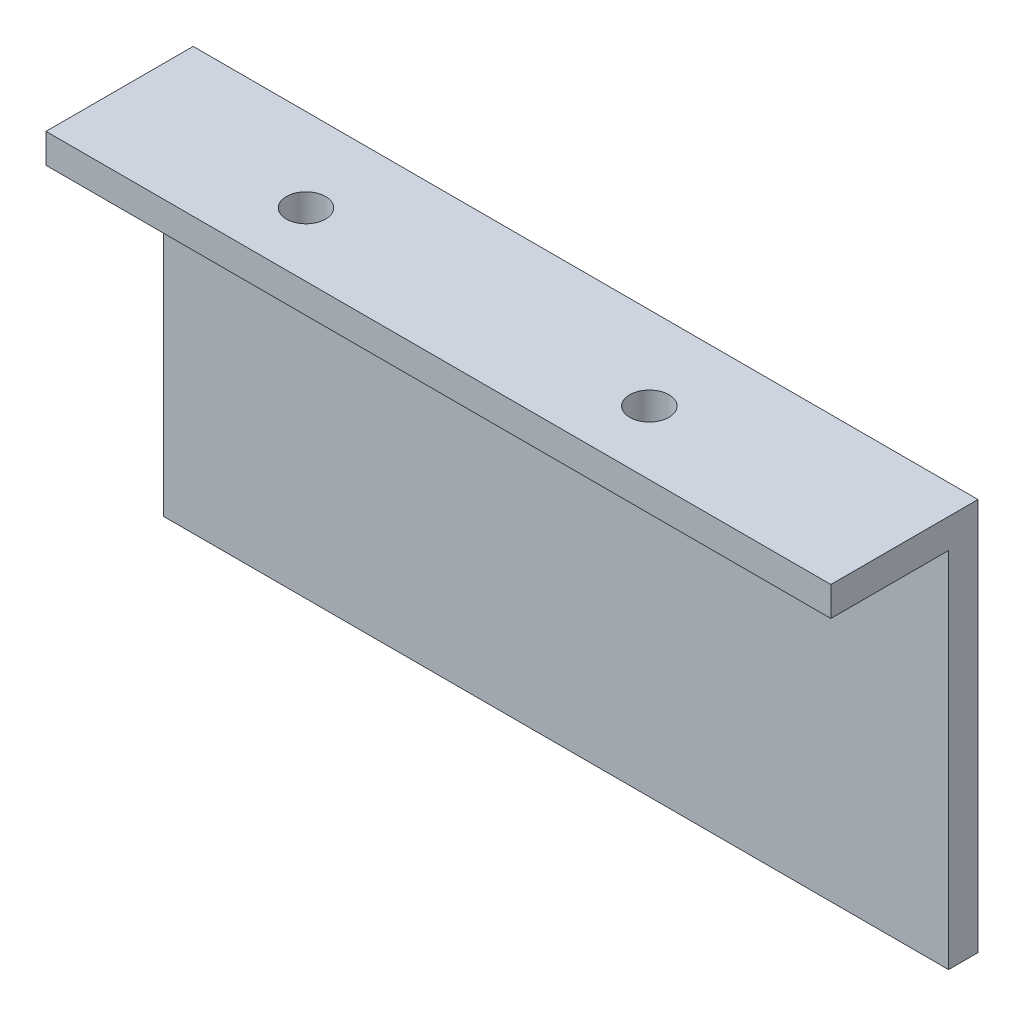
ISO-10303-21;
HEADER;
FILE_DESCRIPTION(('STEP AP214'),'2;1');
FILE_NAME('part.step','',(''),(''),'','','');
FILE_SCHEMA(('AUTOMOTIVE_DESIGN { 1 0 10303 214 1 1 1 1 }'));
ENDSEC;
DATA;
#1=APPLICATION_CONTEXT('core data for automotive mechanical design processes');
#2=APPLICATION_PROTOCOL_DEFINITION('international standard','automotive_design',2000,#1);
#3=PRODUCT_CONTEXT('',#1,'mechanical');
#4=PRODUCT('Part','Part','',(#3));
#5=PRODUCT_RELATED_PRODUCT_CATEGORY('part','',(#4));
#6=PRODUCT_DEFINITION_FORMATION('','',#4);
#7=PRODUCT_DEFINITION_CONTEXT('part definition',#1,'design');
#8=PRODUCT_DEFINITION('design','',#6,#7);
#9=PRODUCT_DEFINITION_SHAPE('','',#8);
#10=(LENGTH_UNIT() NAMED_UNIT(*) SI_UNIT(.MILLI.,.METRE.));
#11=(NAMED_UNIT(*) PLANE_ANGLE_UNIT() SI_UNIT($,.RADIAN.));
#12=(NAMED_UNIT(*) SI_UNIT($,.STERADIAN.) SOLID_ANGLE_UNIT());
#13=UNCERTAINTY_MEASURE_WITH_UNIT(LENGTH_MEASURE(1.E-05),#10,'distance_accuracy_value','');
#14=(GEOMETRIC_REPRESENTATION_CONTEXT(3) GLOBAL_UNCERTAINTY_ASSIGNED_CONTEXT((#13)) GLOBAL_UNIT_ASSIGNED_CONTEXT((#10,
#11,#12)) REPRESENTATION_CONTEXT('',''));
#15=CARTESIAN_POINT('',(0.,0.,0.));
#16=DIRECTION('',(0.,0.,1.));
#17=DIRECTION('',(1.,0.,0.));
#18=AXIS2_PLACEMENT_3D('',#15,#16,#17);
#19=CARTESIAN_POINT('',(40.,20.,3.));
#20=DIRECTION('',(-1.,0.,0.));
#21=DIRECTION('',(0.,-1.,0.));
#22=AXIS2_PLACEMENT_3D('',#19,#20,#21);
#23=PLANE('',#22);
#24=DIRECTION('',(0.,1.,0.));
#25=VECTOR('',#24,1.);
#26=CARTESIAN_POINT('',(40.,20.,0.));
#27=LINE('',#26,#25);
#28=CARTESIAN_POINT('',(40.,-20.,0.));
#29=VERTEX_POINT('',#28);
#30=CARTESIAN_POINT('',(40.,20.,0.));
#31=VERTEX_POINT('',#30);
#32=EDGE_CURVE('E98',#29,#31,#27,.T.);
#33=ORIENTED_EDGE('',*,*,#32,.T.);
#34=DIRECTION('',(0.,0.,-1.));
#35=VECTOR('',#34,1.);
#36=CARTESIAN_POINT('',(40.,20.,3.));
#37=LINE('',#36,#35);
#38=CARTESIAN_POINT('',(40.,20.,15.));
#39=VERTEX_POINT('',#38);
#40=EDGE_CURVE('E11',#39,#31,#37,.T.);
#41=ORIENTED_EDGE('',*,*,#40,.F.);
#42=DIRECTION('',(0.,1.,0.));
#43=VECTOR('',#42,1.);
#44=CARTESIAN_POINT('',(40.,20.,15.));
#45=LINE('',#44,#43);
#46=CARTESIAN_POINT('',(40.,17.,15.));
#47=VERTEX_POINT('',#46);
#48=EDGE_CURVE('E148',#47,#39,#45,.T.);
#49=ORIENTED_EDGE('',*,*,#48,.F.);
#50=DIRECTION('',(0.,0.,-1.));
#51=VECTOR('',#50,1.);
#52=CARTESIAN_POINT('',(40.,17.,15.));
#53=LINE('',#52,#51);
#54=CARTESIAN_POINT('',(40.,17.,3.));
#55=VERTEX_POINT('',#54);
#56=EDGE_CURVE('E111',#47,#55,#53,.T.);
#57=ORIENTED_EDGE('',*,*,#56,.T.);
#58=DIRECTION('',(0.,1.,0.));
#59=VECTOR('',#58,1.);
#60=CARTESIAN_POINT('',(40.,20.,3.));
#61=LINE('',#60,#59);
#62=CARTESIAN_POINT('',(40.,-20.,3.));
#63=VERTEX_POINT('',#62);
#64=EDGE_CURVE('E92',#63,#55,#61,.T.);
#65=ORIENTED_EDGE('',*,*,#64,.F.);
#66=DIRECTION('',(0.,0.,-1.));
#67=VECTOR('',#66,1.);
#68=CARTESIAN_POINT('',(40.,-20.,3.));
#69=LINE('',#68,#67);
#70=EDGE_CURVE('E84',#63,#29,#69,.T.);
#71=ORIENTED_EDGE('',*,*,#70,.T.);
#72=EDGE_LOOP('',(#33,#41,#49,#57,#65,#71));
#73=FACE_BOUND('',#72,.T.);
#74=ADVANCED_FACE('F39',(#73),#23,.F.);
#75=CARTESIAN_POINT('',(-40.,20.,3.));
#76=DIRECTION('',(0.,-1.,0.));
#77=DIRECTION('',(0.,0.,-1.));
#78=AXIS2_PLACEMENT_3D('',#75,#76,#77);
#79=PLANE('',#78);
#80=CARTESIAN_POINT('',(15.,20.,8.5));
#81=DIRECTION('',(0.,1.,0.));
#82=DIRECTION('',(0.,0.,1.));
#83=AXIS2_PLACEMENT_3D('',#80,#81,#82);
#84=CIRCLE('',#83,2.);
#85=CARTESIAN_POINT('',(15.,20.,10.5));
#86=VERTEX_POINT('',#85);
#87=EDGE_CURVE('E125',#86,#86,#84,.T.);
#88=ORIENTED_EDGE('',*,*,#87,.F.);
#89=EDGE_LOOP('',(#88));
#90=FACE_BOUND('',#89,.T.);
#91=CARTESIAN_POINT('',(-20.,20.,8.5));
#92=DIRECTION('',(0.,1.,0.));
#93=DIRECTION('',(0.,0.,1.));
#94=AXIS2_PLACEMENT_3D('',#91,#92,#93);
#95=CIRCLE('',#94,2.);
#96=CARTESIAN_POINT('',(-20.,20.,10.5));
#97=VERTEX_POINT('',#96);
#98=EDGE_CURVE('E132',#97,#97,#95,.T.);
#99=ORIENTED_EDGE('',*,*,#98,.F.);
#100=EDGE_LOOP('',(#99));
#101=FACE_BOUND('',#100,.T.);
#102=DIRECTION('',(-1.,0.,0.));
#103=VECTOR('',#102,1.);
#104=CARTESIAN_POINT('',(-40.,20.,0.));
#105=LINE('',#104,#103);
#106=CARTESIAN_POINT('',(-40.,20.,0.));
#107=VERTEX_POINT('',#106);
#108=EDGE_CURVE('E103',#31,#107,#105,.T.);
#109=ORIENTED_EDGE('',*,*,#108,.T.);
#110=DIRECTION('',(0.,0.,-1.));
#111=VECTOR('',#110,1.);
#112=CARTESIAN_POINT('',(-40.,20.,3.));
#113=LINE('',#112,#111);
#114=CARTESIAN_POINT('',(-40.,20.,15.));
#115=VERTEX_POINT('',#114);
#116=EDGE_CURVE('E48',#115,#107,#113,.T.);
#117=ORIENTED_EDGE('',*,*,#116,.F.);
#118=DIRECTION('',(-1.,0.,0.));
#119=VECTOR('',#118,1.);
#120=CARTESIAN_POINT('',(-40.,20.,15.));
#121=LINE('',#120,#119);
#122=EDGE_CURVE('E152',#39,#115,#121,.T.);
#123=ORIENTED_EDGE('',*,*,#122,.F.);
#124=ORIENTED_EDGE('',*,*,#40,.T.);
#125=EDGE_LOOP('',(#109,#117,#123,#124));
#126=FACE_BOUND('',#125,.T.);
#127=ADVANCED_FACE('F172',(#90,#101,#126),#79,.F.);
#128=CARTESIAN_POINT('',(-40.,20.,3.));
#129=DIRECTION('',(1.,0.,0.));
#130=DIRECTION('',(0.,0.,-1.));
#131=AXIS2_PLACEMENT_3D('',#128,#129,#130);
#132=PLANE('',#131);
#133=DIRECTION('',(0.,-1.,0.));
#134=VECTOR('',#133,1.);
#135=CARTESIAN_POINT('',(-40.,20.,0.));
#136=LINE('',#135,#134);
#137=CARTESIAN_POINT('',(-40.,-20.,0.));
#138=VERTEX_POINT('',#137);
#139=EDGE_CURVE('E93',#107,#138,#136,.T.);
#140=ORIENTED_EDGE('',*,*,#139,.T.);
#141=DIRECTION('',(0.,0.,-1.));
#142=VECTOR('',#141,1.);
#143=CARTESIAN_POINT('',(-40.,-20.,3.));
#144=LINE('',#143,#142);
#145=CARTESIAN_POINT('',(-40.,-20.,3.));
#146=VERTEX_POINT('',#145);
#147=EDGE_CURVE('E87',#146,#138,#144,.T.);
#148=ORIENTED_EDGE('',*,*,#147,.F.);
#149=DIRECTION('',(0.,-1.,0.));
#150=VECTOR('',#149,1.);
#151=CARTESIAN_POINT('',(-40.,20.,3.));
#152=LINE('',#151,#150);
#153=CARTESIAN_POINT('',(-40.,17.,3.));
#154=VERTEX_POINT('',#153);
#155=EDGE_CURVE('E161',#154,#146,#152,.T.);
#156=ORIENTED_EDGE('',*,*,#155,.F.);
#157=DIRECTION('',(0.,0.,-1.));
#158=VECTOR('',#157,1.);
#159=CARTESIAN_POINT('',(-40.,17.,15.));
#160=LINE('',#159,#158);
#161=CARTESIAN_POINT('',(-40.,17.,15.));
#162=VERTEX_POINT('',#161);
#163=EDGE_CURVE('E105',#162,#154,#160,.T.);
#164=ORIENTED_EDGE('',*,*,#163,.F.);
#165=DIRECTION('',(0.,-1.,0.));
#166=VECTOR('',#165,1.);
#167=CARTESIAN_POINT('',(-40.,20.,15.));
#168=LINE('',#167,#166);
#169=EDGE_CURVE('E140',#115,#162,#168,.T.);
#170=ORIENTED_EDGE('',*,*,#169,.F.);
#171=ORIENTED_EDGE('',*,*,#116,.T.);
#172=EDGE_LOOP('',(#140,#148,#156,#164,#170,#171));
#173=FACE_BOUND('',#172,.T.);
#174=ADVANCED_FACE('F167',(#173),#132,.F.);
#175=CARTESIAN_POINT('',(-40.,-20.,3.));
#176=DIRECTION('',(0.,1.,0.));
#177=DIRECTION('',(0.,0.,1.));
#178=AXIS2_PLACEMENT_3D('',#175,#176,#177);
#179=PLANE('',#178);
#180=DIRECTION('',(1.,0.,0.));
#181=VECTOR('',#180,1.);
#182=CARTESIAN_POINT('',(-40.,-20.,0.));
#183=LINE('',#182,#181);
#184=EDGE_CURVE('E81',#138,#29,#183,.T.);
#185=ORIENTED_EDGE('',*,*,#184,.T.);
#186=ORIENTED_EDGE('',*,*,#70,.F.);
#187=DIRECTION('',(1.,0.,0.));
#188=VECTOR('',#187,1.);
#189=CARTESIAN_POINT('',(-40.,-20.,3.));
#190=LINE('',#189,#188);
#191=EDGE_CURVE('E62',#146,#63,#190,.T.);
#192=ORIENTED_EDGE('',*,*,#191,.F.);
#193=ORIENTED_EDGE('',*,*,#147,.T.);
#194=EDGE_LOOP('',(#185,#186,#192,#193));
#195=FACE_BOUND('',#194,.T.);
#196=ADVANCED_FACE('F83',(#195),#179,.F.);
#197=CARTESIAN_POINT('',(0.,0.,3.));
#198=DIRECTION('',(0.,0.,1.));
#199=DIRECTION('',(1.,0.,0.));
#200=AXIS2_PLACEMENT_3D('',#197,#198,#199);
#201=PLANE('',#200);
#202=DIRECTION('',(1.,0.,0.));
#203=VECTOR('',#202,1.);
#204=CARTESIAN_POINT('',(-40.,17.,3.));
#205=LINE('',#204,#203);
#206=EDGE_CURVE('E56',#154,#55,#205,.T.);
#207=ORIENTED_EDGE('',*,*,#206,.F.);
#208=ORIENTED_EDGE('',*,*,#155,.T.);
#209=ORIENTED_EDGE('',*,*,#191,.T.);
#210=ORIENTED_EDGE('',*,*,#64,.T.);
#211=EDGE_LOOP('',(#207,#208,#209,#210));
#212=FACE_BOUND('',#211,.T.);
#213=ADVANCED_FACE('F164',(#212),#201,.T.);
#214=CARTESIAN_POINT('',(0.,0.,0.));
#215=DIRECTION('',(0.,0.,1.));
#216=DIRECTION('',(1.,0.,0.));
#217=AXIS2_PLACEMENT_3D('',#214,#215,#216);
#218=PLANE('',#217);
#219=ORIENTED_EDGE('',*,*,#32,.F.);
#220=ORIENTED_EDGE('',*,*,#184,.F.);
#221=ORIENTED_EDGE('',*,*,#139,.F.);
#222=ORIENTED_EDGE('',*,*,#108,.F.);
#223=EDGE_LOOP('',(#219,#220,#221,#222));
#224=FACE_BOUND('',#223,.T.);
#225=ADVANCED_FACE('F102',(#224),#218,.F.);
#226=CARTESIAN_POINT('',(-40.,17.,15.));
#227=DIRECTION('',(0.,1.,0.));
#228=DIRECTION('',(-1.,0.,0.));
#229=AXIS2_PLACEMENT_3D('',#226,#227,#228);
#230=PLANE('',#229);
#231=CARTESIAN_POINT('',(15.,17.,8.5));
#232=DIRECTION('',(0.,1.,0.));
#233=DIRECTION('',(-1.,0.,0.));
#234=AXIS2_PLACEMENT_3D('',#231,#232,#233);
#235=CIRCLE('',#234,2.);
#236=CARTESIAN_POINT('',(13.,17.,8.5));
#237=VERTEX_POINT('',#236);
#238=EDGE_CURVE('E42',#237,#237,#235,.T.);
#239=ORIENTED_EDGE('',*,*,#238,.T.);
#240=EDGE_LOOP('',(#239));
#241=FACE_BOUND('',#240,.T.);
#242=CARTESIAN_POINT('',(-20.,17.,8.5));
#243=DIRECTION('',(0.,1.,0.));
#244=DIRECTION('',(-1.,0.,0.));
#245=AXIS2_PLACEMENT_3D('',#242,#243,#244);
#246=CIRCLE('',#245,2.);
#247=CARTESIAN_POINT('',(-22.,17.,8.5));
#248=VERTEX_POINT('',#247);
#249=EDGE_CURVE('E122',#248,#248,#246,.T.);
#250=ORIENTED_EDGE('',*,*,#249,.T.);
#251=EDGE_LOOP('',(#250));
#252=FACE_BOUND('',#251,.T.);
#253=ORIENTED_EDGE('',*,*,#206,.T.);
#254=ORIENTED_EDGE('',*,*,#56,.F.);
#255=DIRECTION('',(1.,0.,0.));
#256=VECTOR('',#255,1.);
#257=CARTESIAN_POINT('',(-40.,17.,15.));
#258=LINE('',#257,#256);
#259=EDGE_CURVE('E144',#162,#47,#258,.T.);
#260=ORIENTED_EDGE('',*,*,#259,.F.);
#261=ORIENTED_EDGE('',*,*,#163,.T.);
#262=EDGE_LOOP('',(#253,#254,#260,#261));
#263=FACE_BOUND('',#262,.T.);
#264=ADVANCED_FACE('F187',(#241,#252,#263),#230,.F.);
#265=CARTESIAN_POINT('',(0.,0.,15.));
#266=DIRECTION('',(0.,0.,1.));
#267=DIRECTION('',(1.,0.,0.));
#268=AXIS2_PLACEMENT_3D('',#265,#266,#267);
#269=PLANE('',#268);
#270=ORIENTED_EDGE('',*,*,#169,.T.);
#271=ORIENTED_EDGE('',*,*,#259,.T.);
#272=ORIENTED_EDGE('',*,*,#48,.T.);
#273=ORIENTED_EDGE('',*,*,#122,.T.);
#274=EDGE_LOOP('',(#270,#271,#272,#273));
#275=FACE_BOUND('',#274,.T.);
#276=ADVANCED_FACE('F176',(#275),#269,.T.);
#277=CARTESIAN_POINT('',(-20.,8.,8.5));
#278=DIRECTION('',(0.,1.,0.));
#279=DIRECTION('',(0.,0.,1.));
#280=AXIS2_PLACEMENT_3D('',#277,#278,#279);
#281=CYLINDRICAL_SURFACE('',#280,2.);
#282=ORIENTED_EDGE('',*,*,#98,.T.);
#283=EDGE_LOOP('',(#282));
#284=FACE_BOUND('',#283,.T.);
#285=ORIENTED_EDGE('',*,*,#249,.F.);
#286=EDGE_LOOP('',(#285));
#287=FACE_BOUND('',#286,.T.);
#288=ADVANCED_FACE('F195',(#284,#287),#281,.F.);
#289=CARTESIAN_POINT('',(15.,8.,8.5));
#290=DIRECTION('',(0.,1.,0.));
#291=DIRECTION('',(0.,0.,1.));
#292=AXIS2_PLACEMENT_3D('',#289,#290,#291);
#293=CYLINDRICAL_SURFACE('',#292,2.);
#294=ORIENTED_EDGE('',*,*,#87,.T.);
#295=EDGE_LOOP('',(#294));
#296=FACE_BOUND('',#295,.T.);
#297=ORIENTED_EDGE('',*,*,#238,.F.);
#298=EDGE_LOOP('',(#297));
#299=FACE_BOUND('',#298,.T.);
#300=ADVANCED_FACE('F259',(#296,#299),#293,.F.);
#301=CLOSED_SHELL('',(#74,#127,#174,#196,#213,#225,#264,#276,#288,#300));
#302=MANIFOLD_SOLID_BREP('B2',#301);
#303=ADVANCED_BREP_SHAPE_REPRESENTATION('',(#18,#302),#14);
#304=SHAPE_DEFINITION_REPRESENTATION(#9,#303);
ENDSEC;
END-ISO-10303-21;
